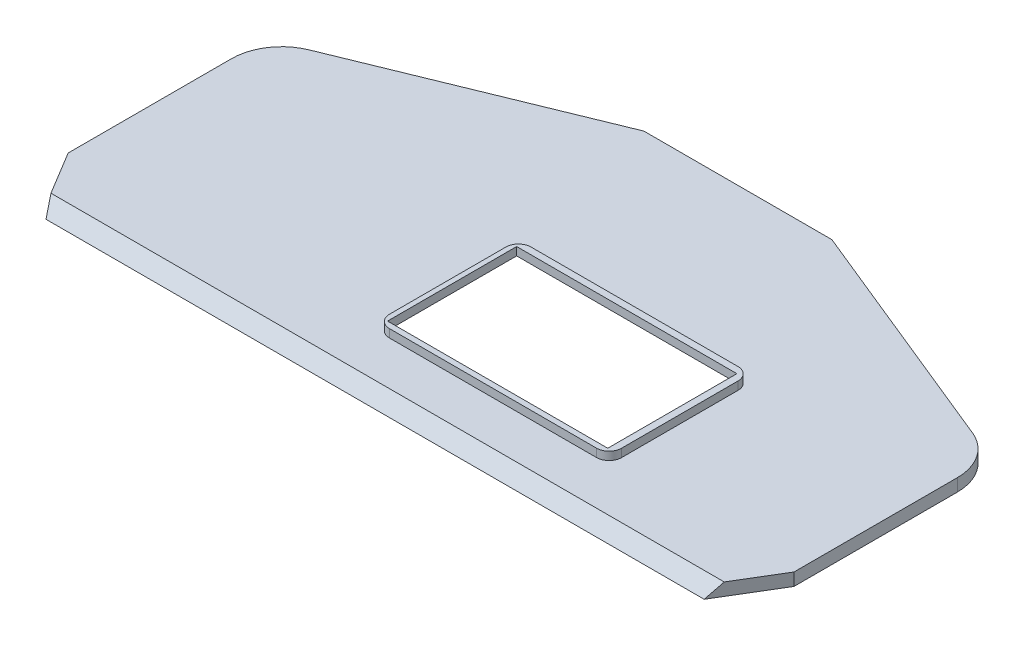
ISO-10303-21;
HEADER;
FILE_DESCRIPTION(('STEP AP214'),'2;1');
FILE_NAME('part.step','',(''),(''),'','','');
FILE_SCHEMA(('AUTOMOTIVE_DESIGN { 1 0 10303 214 1 1 1 1 }'));
ENDSEC;
DATA;
#1=APPLICATION_CONTEXT('core data for automotive mechanical design processes');
#2=APPLICATION_PROTOCOL_DEFINITION('international standard','automotive_design',2000,#1);
#3=PRODUCT_CONTEXT('',#1,'mechanical');
#4=PRODUCT('Part','Part','',(#3));
#5=PRODUCT_RELATED_PRODUCT_CATEGORY('part','',(#4));
#6=PRODUCT_DEFINITION_FORMATION('','',#4);
#7=PRODUCT_DEFINITION_CONTEXT('part definition',#1,'design');
#8=PRODUCT_DEFINITION('design','',#6,#7);
#9=PRODUCT_DEFINITION_SHAPE('','',#8);
#10=(LENGTH_UNIT() NAMED_UNIT(*) SI_UNIT(.MILLI.,.METRE.));
#11=(NAMED_UNIT(*) PLANE_ANGLE_UNIT() SI_UNIT($,.RADIAN.));
#12=(NAMED_UNIT(*) SI_UNIT($,.STERADIAN.) SOLID_ANGLE_UNIT());
#13=UNCERTAINTY_MEASURE_WITH_UNIT(LENGTH_MEASURE(1.E-05),#10,'distance_accuracy_value','');
#14=(GEOMETRIC_REPRESENTATION_CONTEXT(3) GLOBAL_UNCERTAINTY_ASSIGNED_CONTEXT((#13)) GLOBAL_UNIT_ASSIGNED_CONTEXT((#10,
#11,#12)) REPRESENTATION_CONTEXT('',''));
#15=CARTESIAN_POINT('',(0.,0.,0.));
#16=DIRECTION('',(0.,0.,1.));
#17=DIRECTION('',(1.,0.,0.));
#18=AXIS2_PLACEMENT_3D('',#15,#16,#17);
#19=CARTESIAN_POINT('',(-6.68634207264396,3.3,-29.1142175540504));
#20=DIRECTION('',(0.,1.,0.));
#21=DIRECTION('',(0.,0.,1.));
#22=AXIS2_PLACEMENT_3D('',#19,#20,#21);
#23=CYLINDRICAL_SURFACE('',#22,2.);
#24=DIRECTION('',(0.,1.,0.));
#25=VECTOR('',#24,1.);
#26=CARTESIAN_POINT('',(-8.68634207264396,3.3,-29.1142175540504));
#27=LINE('',#26,#25);
#28=CARTESIAN_POINT('',(-8.68634207264396,2.,-29.1142175540504));
#29=VERTEX_POINT('',#28);
#30=CARTESIAN_POINT('',(-8.68634207264396,3.3,-29.1142175540504));
#31=VERTEX_POINT('',#30);
#32=EDGE_CURVE('E356',#29,#31,#27,.T.);
#33=ORIENTED_EDGE('',*,*,#32,.F.);
#34=CARTESIAN_POINT('',(-6.68634207264396,2.,-29.1142175540504));
#35=DIRECTION('',(0.,-1.,0.));
#36=DIRECTION('',(0.,0.,-1.));
#37=AXIS2_PLACEMENT_3D('',#34,#35,#36);
#38=CIRCLE('',#37,2.);
#39=CARTESIAN_POINT('',(-6.68634207264396,2.,-27.1142175540504));
#40=VERTEX_POINT('',#39);
#41=EDGE_CURVE('E364',#29,#40,#38,.F.);
#42=ORIENTED_EDGE('',*,*,#41,.T.);
#43=DIRECTION('',(0.,1.,0.));
#44=VECTOR('',#43,1.);
#45=CARTESIAN_POINT('',(-6.68634207264396,3.3,-27.1142175540504));
#46=LINE('',#45,#44);
#47=CARTESIAN_POINT('',(-6.68634207264396,3.3,-27.1142175540504));
#48=VERTEX_POINT('',#47);
#49=EDGE_CURVE('E359',#48,#40,#46,.F.);
#50=ORIENTED_EDGE('',*,*,#49,.F.);
#51=CARTESIAN_POINT('',(-6.68634207264396,3.3,-29.1142175540504));
#52=DIRECTION('',(0.,-1.,0.));
#53=DIRECTION('',(0.,0.,-1.));
#54=AXIS2_PLACEMENT_3D('',#51,#52,#53);
#55=CIRCLE('',#54,2.);
#56=EDGE_CURVE('E362',#31,#48,#55,.F.);
#57=ORIENTED_EDGE('',*,*,#56,.F.);
#58=EDGE_LOOP('',(#33,#42,#50,#57));
#59=FACE_BOUND('',#58,.T.);
#60=ADVANCED_FACE('F35',(#59),#23,.T.);
#61=CARTESIAN_POINT('',(26.3385652794544,3.3,-29.1142175540504));
#62=DIRECTION('',(0.,1.,0.));
#63=DIRECTION('',(0.,0.,1.));
#64=AXIS2_PLACEMENT_3D('',#61,#62,#63);
#65=CYLINDRICAL_SURFACE('',#64,2.);
#66=DIRECTION('',(0.,1.,0.));
#67=VECTOR('',#66,1.);
#68=CARTESIAN_POINT('',(26.3385652794544,3.3,-27.1142175540504));
#69=LINE('',#68,#67);
#70=CARTESIAN_POINT('',(26.3385652794544,2.,-27.1142175540504));
#71=VERTEX_POINT('',#70);
#72=CARTESIAN_POINT('',(26.3385652794544,3.3,-27.1142175540504));
#73=VERTEX_POINT('',#72);
#74=EDGE_CURVE('E346',#71,#73,#69,.T.);
#75=ORIENTED_EDGE('',*,*,#74,.F.);
#76=CARTESIAN_POINT('',(26.3385652794544,2.,-29.1142175540504));
#77=DIRECTION('',(0.,-1.,0.));
#78=DIRECTION('',(0.,0.,-1.));
#79=AXIS2_PLACEMENT_3D('',#76,#77,#78);
#80=CIRCLE('',#79,2.);
#81=CARTESIAN_POINT('',(28.3385652794544,2.,-29.1142175540504));
#82=VERTEX_POINT('',#81);
#83=EDGE_CURVE('E354',#71,#82,#80,.F.);
#84=ORIENTED_EDGE('',*,*,#83,.T.);
#85=DIRECTION('',(0.,1.,0.));
#86=VECTOR('',#85,1.);
#87=CARTESIAN_POINT('',(28.3385652794544,3.3,-29.1142175540504));
#88=LINE('',#87,#86);
#89=CARTESIAN_POINT('',(28.3385652794544,3.3,-29.1142175540504));
#90=VERTEX_POINT('',#89);
#91=EDGE_CURVE('E349',#90,#82,#88,.F.);
#92=ORIENTED_EDGE('',*,*,#91,.F.);
#93=CARTESIAN_POINT('',(26.3385652794544,3.3,-29.1142175540504));
#94=DIRECTION('',(0.,-1.,0.));
#95=DIRECTION('',(0.,0.,-1.));
#96=AXIS2_PLACEMENT_3D('',#93,#94,#95);
#97=CIRCLE('',#96,2.);
#98=EDGE_CURVE('E352',#73,#90,#97,.F.);
#99=ORIENTED_EDGE('',*,*,#98,.F.);
#100=EDGE_LOOP('',(#75,#84,#92,#99));
#101=FACE_BOUND('',#100,.T.);
#102=ADVANCED_FACE('F462',(#101),#65,.T.);
#103=CARTESIAN_POINT('',(26.3385652794544,3.3,-47.6782183309184));
#104=DIRECTION('',(0.,1.,0.));
#105=DIRECTION('',(0.,0.,1.));
#106=AXIS2_PLACEMENT_3D('',#103,#104,#105);
#107=CYLINDRICAL_SURFACE('',#106,2.);
#108=DIRECTION('',(0.,1.,0.));
#109=VECTOR('',#108,1.);
#110=CARTESIAN_POINT('',(28.3385652794544,3.3,-47.6782183309184));
#111=LINE('',#110,#109);
#112=CARTESIAN_POINT('',(28.3385652794544,2.,-47.6782183309184));
#113=VERTEX_POINT('',#112);
#114=CARTESIAN_POINT('',(28.3385652794544,3.3,-47.6782183309184));
#115=VERTEX_POINT('',#114);
#116=EDGE_CURVE('E336',#113,#115,#111,.T.);
#117=ORIENTED_EDGE('',*,*,#116,.F.);
#118=CARTESIAN_POINT('',(26.3385652794544,2.,-47.6782183309184));
#119=DIRECTION('',(0.,-1.,0.));
#120=DIRECTION('',(0.,0.,-1.));
#121=AXIS2_PLACEMENT_3D('',#118,#119,#120);
#122=CIRCLE('',#121,2.);
#123=CARTESIAN_POINT('',(26.3385652794544,2.,-49.6782183309184));
#124=VERTEX_POINT('',#123);
#125=EDGE_CURVE('E344',#113,#124,#122,.F.);
#126=ORIENTED_EDGE('',*,*,#125,.T.);
#127=DIRECTION('',(0.,1.,0.));
#128=VECTOR('',#127,1.);
#129=CARTESIAN_POINT('',(26.3385652794544,3.3,-49.6782183309184));
#130=LINE('',#129,#128);
#131=CARTESIAN_POINT('',(26.3385652794544,3.3,-49.6782183309184));
#132=VERTEX_POINT('',#131);
#133=EDGE_CURVE('E339',#132,#124,#130,.F.);
#134=ORIENTED_EDGE('',*,*,#133,.F.);
#135=CARTESIAN_POINT('',(26.3385652794544,3.3,-47.6782183309184));
#136=DIRECTION('',(0.,-1.,0.));
#137=DIRECTION('',(0.,0.,-1.));
#138=AXIS2_PLACEMENT_3D('',#135,#136,#137);
#139=CIRCLE('',#138,2.);
#140=EDGE_CURVE('E342',#115,#132,#139,.F.);
#141=ORIENTED_EDGE('',*,*,#140,.F.);
#142=EDGE_LOOP('',(#117,#126,#134,#141));
#143=FACE_BOUND('',#142,.T.);
#144=ADVANCED_FACE('F468',(#143),#107,.T.);
#145=CARTESIAN_POINT('',(-6.68634207264396,3.3,-47.6782183309184));
#146=DIRECTION('',(0.,-1.,0.));
#147=DIRECTION('',(0.,0.,-1.));
#148=AXIS2_PLACEMENT_3D('',#145,#146,#147);
#149=CYLINDRICAL_SURFACE('',#148,2.);
#150=DIRECTION('',(0.,-1.,0.));
#151=VECTOR('',#150,1.);
#152=CARTESIAN_POINT('',(-8.68634207264396,3.3,-47.6782183309184));
#153=LINE('',#152,#151);
#154=CARTESIAN_POINT('',(-8.68634207264396,3.3,-47.6782183309184));
#155=VERTEX_POINT('',#154);
#156=CARTESIAN_POINT('',(-8.68634207264396,2.,-47.6782183309184));
#157=VERTEX_POINT('',#156);
#158=EDGE_CURVE('E326',#155,#157,#153,.T.);
#159=ORIENTED_EDGE('',*,*,#158,.F.);
#160=CARTESIAN_POINT('',(-6.68634207264396,3.3,-47.6782183309184));
#161=DIRECTION('',(0.,-1.,0.));
#162=DIRECTION('',(0.,0.,-1.));
#163=AXIS2_PLACEMENT_3D('',#160,#161,#162);
#164=CIRCLE('',#163,2.);
#165=CARTESIAN_POINT('',(-6.68634207264396,3.3,-49.6782183309184));
#166=VERTEX_POINT('',#165);
#167=EDGE_CURVE('E332',#166,#155,#164,.F.);
#168=ORIENTED_EDGE('',*,*,#167,.F.);
#169=DIRECTION('',(0.,-1.,0.));
#170=VECTOR('',#169,1.);
#171=CARTESIAN_POINT('',(-6.68634207264396,3.3,-49.6782183309184));
#172=LINE('',#171,#170);
#173=CARTESIAN_POINT('',(-6.68634207264396,2.,-49.6782183309184));
#174=VERTEX_POINT('',#173);
#175=EDGE_CURVE('E329',#174,#166,#172,.F.);
#176=ORIENTED_EDGE('',*,*,#175,.F.);
#177=CARTESIAN_POINT('',(-6.68634207264396,2.,-47.6782183309184));
#178=DIRECTION('',(0.,-1.,0.));
#179=DIRECTION('',(0.,0.,-1.));
#180=AXIS2_PLACEMENT_3D('',#177,#178,#179);
#181=CIRCLE('',#180,2.);
#182=EDGE_CURVE('E334',#174,#157,#181,.F.);
#183=ORIENTED_EDGE('',*,*,#182,.T.);
#184=EDGE_LOOP('',(#159,#168,#176,#183));
#185=FACE_BOUND('',#184,.T.);
#186=ADVANCED_FACE('F458',(#185),#149,.T.);
#187=CARTESIAN_POINT('',(0.,2.,0.));
#188=DIRECTION('',(0.,-1.,0.));
#189=DIRECTION('',(0.,0.,-1.));
#190=AXIS2_PLACEMENT_3D('',#187,#188,#189);
#191=PLANE('',#190);
#192=DIRECTION('',(0.516880813371229,0.,0.856057372358124));
#193=VECTOR('',#192,1.);
#194=CARTESIAN_POINT('',(-57.8941255649987,2.,-27.0518446231634));
#195=LINE('',#194,#193);
#196=CARTESIAN_POINT('',(-57.8941255649987,2.,-27.0518446231634));
#197=VERTEX_POINT('',#196);
#198=CARTESIAN_POINT('',(-53.7075845149197,2.,-20.1181004448395));
#199=VERTEX_POINT('',#198);
#200=EDGE_CURVE('E262',#197,#199,#195,.T.);
#201=ORIENTED_EDGE('',*,*,#200,.T.);
#202=DIRECTION('',(1.,0.,0.));
#203=VECTOR('',#202,1.);
#204=CARTESIAN_POINT('',(0.,2.,-20.1181004448395));
#205=LINE('',#204,#203);
#206=CARTESIAN_POINT('',(53.7075845149196,2.,-20.1181004448395));
#207=VERTEX_POINT('',#206);
#208=EDGE_CURVE('E319',#199,#207,#205,.T.);
#209=ORIENTED_EDGE('',*,*,#208,.T.);
#210=DIRECTION('',(0.516880813371228,0.,-0.856057372358125));
#211=VECTOR('',#210,1.);
#212=CARTESIAN_POINT('',(57.8941255649987,2.,-27.0518446231634));
#213=LINE('',#212,#211);
#214=CARTESIAN_POINT('',(57.8941255649987,2.,-27.0518446231634));
#215=VERTEX_POINT('',#214);
#216=EDGE_CURVE('E265',#207,#215,#213,.T.);
#217=ORIENTED_EDGE('',*,*,#216,.T.);
#218=DIRECTION('',(0.,0.,-1.));
#219=VECTOR('',#218,1.);
#220=CARTESIAN_POINT('',(57.8941255649987,2.,-58.4853889543034));
#221=LINE('',#220,#219);
#222=CARTESIAN_POINT('',(57.8941255649987,2.,-53.110753987666));
#223=VERTEX_POINT('',#222);
#224=EDGE_CURVE('E267',#215,#223,#221,.T.);
#225=ORIENTED_EDGE('',*,*,#224,.T.);
#226=CARTESIAN_POINT('',(49.8941255649987,2.,-53.1107539876659));
#227=DIRECTION('',(0.,-1.,0.));
#228=DIRECTION('',(0.,0.,-1.));
#229=AXIS2_PLACEMENT_3D('',#226,#227,#228);
#230=CIRCLE('',#229,8.);
#231=CARTESIAN_POINT('',(52.9183086687649,2.,-60.5171239861804));
#232=VERTEX_POINT('',#231);
#233=EDGE_CURVE('E307',#223,#232,#230,.F.);
#234=ORIENTED_EDGE('',*,*,#233,.T.);
#235=DIRECTION('',(-0.925796249814304,0.,-0.378022887970782));
#236=VECTOR('',#235,1.);
#237=CARTESIAN_POINT('',(15.,2.,-76.));
#238=LINE('',#237,#236);
#239=CARTESIAN_POINT('',(15.,2.,-76.));
#240=VERTEX_POINT('',#239);
#241=EDGE_CURVE('E252',#232,#240,#238,.T.);
#242=ORIENTED_EDGE('',*,*,#241,.T.);
#243=DIRECTION('',(-1.,0.,0.));
#244=VECTOR('',#243,1.);
#245=CARTESIAN_POINT('',(-15.0000000000001,2.,-76.));
#246=LINE('',#245,#244);
#247=CARTESIAN_POINT('',(-15.0000000000001,2.,-76.));
#248=VERTEX_POINT('',#247);
#249=EDGE_CURVE('E254',#240,#248,#246,.T.);
#250=ORIENTED_EDGE('',*,*,#249,.T.);
#251=DIRECTION('',(-0.925796249814304,0.,0.378022887970783));
#252=VECTOR('',#251,1.);
#253=CARTESIAN_POINT('',(-15.0000000000001,2.,-76.));
#254=LINE('',#253,#252);
#255=CARTESIAN_POINT('',(-52.918308668765,2.,-60.5171239861804));
#256=VERTEX_POINT('',#255);
#257=EDGE_CURVE('E257',#248,#256,#254,.T.);
#258=ORIENTED_EDGE('',*,*,#257,.T.);
#259=CARTESIAN_POINT('',(-49.8941255649987,2.,-53.1107539876659));
#260=DIRECTION('',(0.,-1.,0.));
#261=DIRECTION('',(0.,0.,-1.));
#262=AXIS2_PLACEMENT_3D('',#259,#260,#261);
#263=CIRCLE('',#262,8.);
#264=CARTESIAN_POINT('',(-57.8941255649987,2.,-53.1107539876659));
#265=VERTEX_POINT('',#264);
#266=EDGE_CURVE('E317',#256,#265,#263,.F.);
#267=ORIENTED_EDGE('',*,*,#266,.T.);
#268=DIRECTION('',(0.,0.,1.));
#269=VECTOR('',#268,1.);
#270=CARTESIAN_POINT('',(-57.8941255649987,2.,-58.4853889543033));
#271=LINE('',#270,#269);
#272=EDGE_CURVE('E260',#265,#197,#271,.T.);
#273=ORIENTED_EDGE('',*,*,#272,.T.);
#274=EDGE_LOOP('',(#201,#209,#217,#225,#234,#242,#250,#258,#267,#273));
#275=FACE_BOUND('',#274,.T.);
#276=DIRECTION('',(0.,0.,1.));
#277=VECTOR('',#276,1.);
#278=CARTESIAN_POINT('',(-8.68634207264396,2.,-27.1142175540504));
#279=LINE('',#278,#277);
#280=EDGE_CURVE('E230',#157,#29,#279,.T.);
#281=ORIENTED_EDGE('',*,*,#280,.F.);
#282=ORIENTED_EDGE('',*,*,#182,.F.);
#283=DIRECTION('',(-1.,0.,0.));
#284=VECTOR('',#283,1.);
#285=CARTESIAN_POINT('',(-8.68634207264396,2.,-49.6782183309184));
#286=LINE('',#285,#284);
#287=EDGE_CURVE('E235',#124,#174,#286,.T.);
#288=ORIENTED_EDGE('',*,*,#287,.F.);
#289=ORIENTED_EDGE('',*,*,#125,.F.);
#290=DIRECTION('',(0.,0.,-1.));
#291=VECTOR('',#290,1.);
#292=CARTESIAN_POINT('',(28.3385652794544,2.,-49.6782183309184));
#293=LINE('',#292,#291);
#294=EDGE_CURVE('E245',#82,#113,#293,.T.);
#295=ORIENTED_EDGE('',*,*,#294,.F.);
#296=ORIENTED_EDGE('',*,*,#83,.F.);
#297=DIRECTION('',(1.,0.,0.));
#298=VECTOR('',#297,1.);
#299=CARTESIAN_POINT('',(28.3385652794544,2.,-27.1142175540504));
#300=LINE('',#299,#298);
#301=EDGE_CURVE('E243',#40,#71,#300,.T.);
#302=ORIENTED_EDGE('',*,*,#301,.F.);
#303=ORIENTED_EDGE('',*,*,#41,.F.);
#304=EDGE_LOOP('',(#281,#282,#288,#289,#295,#296,#302,#303));
#305=FACE_BOUND('',#304,.T.);
#306=ADVANCED_FACE('F421',(#275,#305),#191,.F.);
#307=CARTESIAN_POINT('',(-49.8941255649987,2.,-53.1107539876659));
#308=DIRECTION('',(0.,1.,0.));
#309=DIRECTION('',(0.,0.,1.));
#310=AXIS2_PLACEMENT_3D('',#307,#308,#309);
#311=CYLINDRICAL_SURFACE('',#310,8.);
#312=DIRECTION('',(0.,1.,0.));
#313=VECTOR('',#312,1.);
#314=CARTESIAN_POINT('',(-52.918308668765,2.,-60.5171239861804));
#315=LINE('',#314,#313);
#316=CARTESIAN_POINT('',(-52.918308668765,0.,-60.5171239861804));
#317=VERTEX_POINT('',#316);
#318=EDGE_CURVE('E309',#317,#256,#315,.T.);
#319=ORIENTED_EDGE('',*,*,#318,.F.);
#320=CARTESIAN_POINT('',(-49.8941255649987,0.,-53.1107539876659));
#321=DIRECTION('',(0.,-1.,0.));
#322=DIRECTION('',(0.,0.,-1.));
#323=AXIS2_PLACEMENT_3D('',#320,#321,#322);
#324=CIRCLE('',#323,8.);
#325=CARTESIAN_POINT('',(-57.8941255649987,0.,-53.1107539876659));
#326=VERTEX_POINT('',#325);
#327=EDGE_CURVE('E315',#326,#317,#324,.T.);
#328=ORIENTED_EDGE('',*,*,#327,.F.);
#329=DIRECTION('',(0.,1.,0.));
#330=VECTOR('',#329,1.);
#331=CARTESIAN_POINT('',(-57.8941255649987,2.,-53.1107539876659));
#332=LINE('',#331,#330);
#333=EDGE_CURVE('E312',#265,#326,#332,.F.);
#334=ORIENTED_EDGE('',*,*,#333,.F.);
#335=ORIENTED_EDGE('',*,*,#266,.F.);
#336=EDGE_LOOP('',(#319,#328,#334,#335));
#337=FACE_BOUND('',#336,.T.);
#338=ADVANCED_FACE('F450',(#337),#311,.T.);
#339=CARTESIAN_POINT('',(49.8941255649987,2.,-53.1107539876659));
#340=DIRECTION('',(0.,1.,0.));
#341=DIRECTION('',(0.,0.,1.));
#342=AXIS2_PLACEMENT_3D('',#339,#340,#341);
#343=CYLINDRICAL_SURFACE('',#342,8.);
#344=DIRECTION('',(0.,1.,0.));
#345=VECTOR('',#344,1.);
#346=CARTESIAN_POINT('',(57.8941255649987,2.,-53.1107539876659));
#347=LINE('',#346,#345);
#348=CARTESIAN_POINT('',(57.8941255649987,0.,-53.110753987666));
#349=VERTEX_POINT('',#348);
#350=EDGE_CURVE('E299',#349,#223,#347,.T.);
#351=ORIENTED_EDGE('',*,*,#350,.F.);
#352=CARTESIAN_POINT('',(49.8941255649987,0.,-53.1107539876659));
#353=DIRECTION('',(0.,-1.,0.));
#354=DIRECTION('',(0.,0.,-1.));
#355=AXIS2_PLACEMENT_3D('',#352,#353,#354);
#356=CIRCLE('',#355,8.);
#357=CARTESIAN_POINT('',(52.9183086687649,0.,-60.5171239861804));
#358=VERTEX_POINT('',#357);
#359=EDGE_CURVE('E305',#358,#349,#356,.T.);
#360=ORIENTED_EDGE('',*,*,#359,.F.);
#361=DIRECTION('',(0.,1.,0.));
#362=VECTOR('',#361,1.);
#363=CARTESIAN_POINT('',(52.9183086687649,2.,-60.5171239861804));
#364=LINE('',#363,#362);
#365=EDGE_CURVE('E302',#232,#358,#364,.F.);
#366=ORIENTED_EDGE('',*,*,#365,.F.);
#367=ORIENTED_EDGE('',*,*,#233,.F.);
#368=EDGE_LOOP('',(#351,#360,#366,#367));
#369=FACE_BOUND('',#368,.T.);
#370=ADVANCED_FACE('F403',(#369),#343,.T.);
#371=CARTESIAN_POINT('',(0.,0.,0.));
#372=DIRECTION('',(0.,-1.,0.));
#373=DIRECTION('',(0.,0.,-1.));
#374=AXIS2_PLACEMENT_3D('',#371,#372,#373);
#375=PLANE('',#374);
#376=DIRECTION('',(-1.,0.,0.));
#377=VECTOR('',#376,1.);
#378=CARTESIAN_POINT('',(-2.06891598330033E-13,0.,-50.6));
#379=LINE('',#378,#377);
#380=CARTESIAN_POINT('',(29.238755392327,0.,-50.6000000000002));
#381=VERTEX_POINT('',#380);
#382=CARTESIAN_POINT('',(-9.89412556499875,0.,-50.6));
#383=VERTEX_POINT('',#382);
#384=EDGE_CURVE('E380',#381,#383,#379,.T.);
#385=ORIENTED_EDGE('',*,*,#384,.T.);
#386=DIRECTION('',(0.,0.,1.));
#387=VECTOR('',#386,1.);
#388=CARTESIAN_POINT('',(-9.89412556499875,0.,-26.));
#389=LINE('',#388,#387);
#390=CARTESIAN_POINT('',(-9.89412556499875,0.,-26.));
#391=VERTEX_POINT('',#390);
#392=EDGE_CURVE('E50',#383,#391,#389,.T.);
#393=ORIENTED_EDGE('',*,*,#392,.T.);
#394=DIRECTION('',(1.,0.,0.));
#395=VECTOR('',#394,1.);
#396=CARTESIAN_POINT('',(0.,0.,-26.));
#397=LINE('',#396,#395);
#398=CARTESIAN_POINT('',(29.238755392327,0.,-26.));
#399=VERTEX_POINT('',#398);
#400=EDGE_CURVE('E370',#391,#399,#397,.T.);
#401=ORIENTED_EDGE('',*,*,#400,.T.);
#402=DIRECTION('',(0.,0.,-1.));
#403=VECTOR('',#402,1.);
#404=CARTESIAN_POINT('',(29.238755392327,0.,-48.6));
#405=LINE('',#404,#403);
#406=EDGE_CURVE('E58',#399,#381,#405,.T.);
#407=ORIENTED_EDGE('',*,*,#406,.T.);
#408=EDGE_LOOP('',(#385,#393,#401,#407));
#409=FACE_BOUND('',#408,.T.);
#410=DIRECTION('',(0.,0.,1.));
#411=VECTOR('',#410,1.);
#412=CARTESIAN_POINT('',(-57.8941255649987,0.,-58.4853889543033));
#413=LINE('',#412,#411);
#414=CARTESIAN_POINT('',(-57.8941255649987,0.,-27.0518446231634));
#415=VERTEX_POINT('',#414);
#416=EDGE_CURVE('E277',#326,#415,#413,.T.);
#417=ORIENTED_EDGE('',*,*,#416,.F.);
#418=ORIENTED_EDGE('',*,*,#327,.T.);
#419=DIRECTION('',(-0.925796249814304,0.,0.378022887970783));
#420=VECTOR('',#419,1.);
#421=CARTESIAN_POINT('',(-15.0000000000001,0.,-76.));
#422=LINE('',#421,#420);
#423=CARTESIAN_POINT('',(-15.0000000000001,0.,-76.));
#424=VERTEX_POINT('',#423);
#425=EDGE_CURVE('E274',#424,#317,#422,.T.);
#426=ORIENTED_EDGE('',*,*,#425,.F.);
#427=DIRECTION('',(-1.,0.,0.));
#428=VECTOR('',#427,1.);
#429=CARTESIAN_POINT('',(-15.0000000000001,0.,-76.));
#430=LINE('',#429,#428);
#431=CARTESIAN_POINT('',(15.,0.,-76.));
#432=VERTEX_POINT('',#431);
#433=EDGE_CURVE('E272',#432,#424,#430,.T.);
#434=ORIENTED_EDGE('',*,*,#433,.F.);
#435=DIRECTION('',(-0.925796249814304,0.,-0.378022887970782));
#436=VECTOR('',#435,1.);
#437=CARTESIAN_POINT('',(15.,0.,-76.));
#438=LINE('',#437,#436);
#439=EDGE_CURVE('E250',#358,#432,#438,.T.);
#440=ORIENTED_EDGE('',*,*,#439,.F.);
#441=ORIENTED_EDGE('',*,*,#359,.T.);
#442=DIRECTION('',(0.,0.,-1.));
#443=VECTOR('',#442,1.);
#444=CARTESIAN_POINT('',(57.8941255649987,0.,-58.4853889543034));
#445=LINE('',#444,#443);
#446=CARTESIAN_POINT('',(57.8941255649987,0.,-27.0518446231634));
#447=VERTEX_POINT('',#446);
#448=EDGE_CURVE('E255',#447,#349,#445,.T.);
#449=ORIENTED_EDGE('',*,*,#448,.F.);
#450=DIRECTION('',(0.516880813371228,0.,-0.856057372358125));
#451=VECTOR('',#450,1.);
#452=CARTESIAN_POINT('',(57.8941255649987,0.,-27.0518446231634));
#453=LINE('',#452,#451);
#454=CARTESIAN_POINT('',(52.5,0.,-18.1181004448395));
#455=VERTEX_POINT('',#454);
#456=EDGE_CURVE('E284',#455,#447,#453,.T.);
#457=ORIENTED_EDGE('',*,*,#456,.F.);
#458=DIRECTION('',(1.,0.,0.));
#459=VECTOR('',#458,1.);
#460=CARTESIAN_POINT('',(-52.5,0.,-18.1181004448394));
#461=LINE('',#460,#459);
#462=CARTESIAN_POINT('',(-52.5,0.,-18.1181004448394));
#463=VERTEX_POINT('',#462);
#464=EDGE_CURVE('E281',#463,#455,#461,.T.);
#465=ORIENTED_EDGE('',*,*,#464,.F.);
#466=DIRECTION('',(0.516880813371229,0.,0.856057372358124));
#467=VECTOR('',#466,1.);
#468=CARTESIAN_POINT('',(-57.8941255649987,0.,-27.0518446231634));
#469=LINE('',#468,#467);
#470=EDGE_CURVE('E279',#415,#463,#469,.T.);
#471=ORIENTED_EDGE('',*,*,#470,.F.);
#472=EDGE_LOOP('',(#417,#418,#426,#434,#440,#441,#449,#457,#465,#471));
#473=FACE_BOUND('',#472,.T.);
#474=ADVANCED_FACE('F399',(#409,#473),#375,.T.);
#475=CARTESIAN_POINT('',(15.,2.,-76.));
#476=DIRECTION('',(-0.378022887970782,0.,0.925796249814304));
#477=DIRECTION('',(0.925796249814304,0.,0.378022887970782));
#478=AXIS2_PLACEMENT_3D('',#475,#476,#477);
#479=PLANE('',#478);
#480=ORIENTED_EDGE('',*,*,#241,.F.);
#481=ORIENTED_EDGE('',*,*,#365,.T.);
#482=ORIENTED_EDGE('',*,*,#439,.T.);
#483=DIRECTION('',(0.,-1.,0.));
#484=VECTOR('',#483,1.);
#485=CARTESIAN_POINT('',(15.,2.,-76.));
#486=LINE('',#485,#484);
#487=EDGE_CURVE('E296',#240,#432,#486,.T.);
#488=ORIENTED_EDGE('',*,*,#487,.F.);
#489=EDGE_LOOP('',(#480,#481,#482,#488));
#490=FACE_BOUND('',#489,.T.);
#491=ADVANCED_FACE('F402',(#490),#479,.F.);
#492=CARTESIAN_POINT('',(-15.0000000000001,2.,-76.));
#493=DIRECTION('',(0.,0.,1.));
#494=DIRECTION('',(1.,0.,0.));
#495=AXIS2_PLACEMENT_3D('',#492,#493,#494);
#496=PLANE('',#495);
#497=ORIENTED_EDGE('',*,*,#433,.T.);
#498=DIRECTION('',(0.,-1.,0.));
#499=VECTOR('',#498,1.);
#500=CARTESIAN_POINT('',(-15.0000000000001,2.,-76.));
#501=LINE('',#500,#499);
#502=EDGE_CURVE('E293',#248,#424,#501,.T.);
#503=ORIENTED_EDGE('',*,*,#502,.F.);
#504=ORIENTED_EDGE('',*,*,#249,.F.);
#505=ORIENTED_EDGE('',*,*,#487,.T.);
#506=EDGE_LOOP('',(#497,#503,#504,#505));
#507=FACE_BOUND('',#506,.T.);
#508=ADVANCED_FACE('F444',(#507),#496,.F.);
#509=CARTESIAN_POINT('',(-15.0000000000001,2.,-76.));
#510=DIRECTION('',(0.378022887970783,0.,0.925796249814304));
#511=DIRECTION('',(0.925796249814304,0.,-0.378022887970783));
#512=AXIS2_PLACEMENT_3D('',#509,#510,#511);
#513=PLANE('',#512);
#514=ORIENTED_EDGE('',*,*,#425,.T.);
#515=ORIENTED_EDGE('',*,*,#318,.T.);
#516=ORIENTED_EDGE('',*,*,#257,.F.);
#517=ORIENTED_EDGE('',*,*,#502,.T.);
#518=EDGE_LOOP('',(#514,#515,#516,#517));
#519=FACE_BOUND('',#518,.T.);
#520=ADVANCED_FACE('F448',(#519),#513,.F.);
#521=CARTESIAN_POINT('',(-57.8941255649987,2.,-58.4853889543033));
#522=DIRECTION('',(1.,0.,0.));
#523=DIRECTION('',(0.,0.,-1.));
#524=AXIS2_PLACEMENT_3D('',#521,#522,#523);
#525=PLANE('',#524);
#526=ORIENTED_EDGE('',*,*,#272,.F.);
#527=ORIENTED_EDGE('',*,*,#333,.T.);
#528=ORIENTED_EDGE('',*,*,#416,.T.);
#529=DIRECTION('',(0.,-1.,0.));
#530=VECTOR('',#529,1.);
#531=CARTESIAN_POINT('',(-57.8941255649987,2.,-27.0518446231634));
#532=LINE('',#531,#530);
#533=EDGE_CURVE('E290',#197,#415,#532,.T.);
#534=ORIENTED_EDGE('',*,*,#533,.F.);
#535=EDGE_LOOP('',(#526,#527,#528,#534));
#536=FACE_BOUND('',#535,.T.);
#537=ADVANCED_FACE('F413',(#536),#525,.F.);
#538=CARTESIAN_POINT('',(-57.8941255649987,2.,-27.0518446231634));
#539=DIRECTION('',(0.856057372358124,0.,-0.516880813371229));
#540=DIRECTION('',(-0.516880813371229,0.,-0.856057372358124));
#541=AXIS2_PLACEMENT_3D('',#538,#539,#540);
#542=PLANE('',#541);
#543=ORIENTED_EDGE('',*,*,#470,.T.);
#544=DIRECTION('',(0.392655696977441,-0.650315886178081,0.650315886178077));
#545=VECTOR('',#544,1.);
#546=CARTESIAN_POINT('',(-45.4270298908069,-11.7142444637324,-6.40385598110714));
#547=LINE('',#546,#545);
#548=EDGE_CURVE('E324',#463,#199,#547,.F.);
#549=ORIENTED_EDGE('',*,*,#548,.T.);
#550=ORIENTED_EDGE('',*,*,#200,.F.);
#551=ORIENTED_EDGE('',*,*,#533,.T.);
#552=EDGE_LOOP('',(#543,#549,#550,#551));
#553=FACE_BOUND('',#552,.T.);
#554=ADVANCED_FACE('F417',(#553),#542,.F.);
#555=CARTESIAN_POINT('',(57.8941255649987,2.,-27.0518446231634));
#556=DIRECTION('',(-0.856057372358125,0.,-0.516880813371228));
#557=DIRECTION('',(-0.516880813371228,0.,0.856057372358125));
#558=AXIS2_PLACEMENT_3D('',#555,#556,#557);
#559=PLANE('',#558);
#560=ORIENTED_EDGE('',*,*,#216,.F.);
#561=DIRECTION('',(0.39265569697744,0.650315886178081,-0.650315886178077));
#562=VECTOR('',#561,1.);
#563=CARTESIAN_POINT('',(45.4270298908069,-11.7142444637324,-6.40385598110718));
#564=LINE('',#563,#562);
#565=EDGE_CURVE('E322',#207,#455,#564,.F.);
#566=ORIENTED_EDGE('',*,*,#565,.T.);
#567=ORIENTED_EDGE('',*,*,#456,.T.);
#568=DIRECTION('',(0.,-1.,0.));
#569=VECTOR('',#568,1.);
#570=CARTESIAN_POINT('',(57.8941255649987,2.,-27.0518446231634));
#571=LINE('',#570,#569);
#572=EDGE_CURVE('E270',#215,#447,#571,.T.);
#573=ORIENTED_EDGE('',*,*,#572,.F.);
#574=EDGE_LOOP('',(#560,#566,#567,#573));
#575=FACE_BOUND('',#574,.T.);
#576=ADVANCED_FACE('F428',(#575),#559,.F.);
#577=CARTESIAN_POINT('',(57.8941255649987,2.,-58.4853889543034));
#578=DIRECTION('',(-1.,0.,0.));
#579=DIRECTION('',(0.,0.,1.));
#580=AXIS2_PLACEMENT_3D('',#577,#578,#579);
#581=PLANE('',#580);
#582=ORIENTED_EDGE('',*,*,#448,.T.);
#583=ORIENTED_EDGE('',*,*,#350,.T.);
#584=ORIENTED_EDGE('',*,*,#224,.F.);
#585=ORIENTED_EDGE('',*,*,#572,.T.);
#586=EDGE_LOOP('',(#582,#583,#584,#585));
#587=FACE_BOUND('',#586,.T.);
#588=ADVANCED_FACE('F434',(#587),#581,.F.);
#589=CARTESIAN_POINT('',(28.5,2.,-28.));
#590=DIRECTION('',(0.,0.,-1.));
#591=DIRECTION('',(-1.,0.,0.));
#592=AXIS2_PLACEMENT_3D('',#589,#590,#591);
#593=PLANE('',#592);
#594=DIRECTION('',(0.,1.,0.));
#595=VECTOR('',#594,1.);
#596=CARTESIAN_POINT('',(27.238755392327,0.,-28.));
#597=LINE('',#596,#595);
#598=CARTESIAN_POINT('',(27.238755392327,1.99999999999999,-28.));
#599=VERTEX_POINT('',#598);
#600=CARTESIAN_POINT('',(27.238755392327,3.3,-28.));
#601=VERTEX_POINT('',#600);
#602=EDGE_CURVE('E211',#599,#601,#597,.T.);
#603=ORIENTED_EDGE('',*,*,#602,.F.);
#604=DIRECTION('',(-1.,0.,0.));
#605=VECTOR('',#604,1.);
#606=CARTESIAN_POINT('',(28.5,2.,-28.));
#607=LINE('',#606,#605);
#608=CARTESIAN_POINT('',(-7.89412556499874,2.,-28.));
#609=VERTEX_POINT('',#608);
#610=EDGE_CURVE('E206',#599,#609,#607,.T.);
#611=ORIENTED_EDGE('',*,*,#610,.T.);
#612=DIRECTION('',(0.,1.,0.));
#613=VECTOR('',#612,1.);
#614=CARTESIAN_POINT('',(-7.89412556499874,-10.,-28.));
#615=LINE('',#614,#613);
#616=CARTESIAN_POINT('',(-7.89412556499874,3.3,-28.));
#617=VERTEX_POINT('',#616);
#618=EDGE_CURVE('E198',#609,#617,#615,.T.);
#619=ORIENTED_EDGE('',*,*,#618,.T.);
#620=DIRECTION('',(1.,0.,0.));
#621=VECTOR('',#620,1.);
#622=CARTESIAN_POINT('',(27.238755392327,3.3,-28.));
#623=LINE('',#622,#621);
#624=EDGE_CURVE('E203',#617,#601,#623,.T.);
#625=ORIENTED_EDGE('',*,*,#624,.T.);
#626=EDGE_LOOP('',(#603,#611,#619,#625));
#627=FACE_BOUND('',#626,.T.);
#628=ADVANCED_FACE('F201',(#627),#593,.T.);
#629=CARTESIAN_POINT('',(0.,2.,-20.1181004448395));
#630=DIRECTION('',(0.,-0.707106781186545,-0.70710678118655));
#631=DIRECTION('',(1.,0.,0.));
#632=AXIS2_PLACEMENT_3D('',#629,#630,#631);
#633=PLANE('',#632);
#634=ORIENTED_EDGE('',*,*,#548,.F.);
#635=ORIENTED_EDGE('',*,*,#464,.T.);
#636=ORIENTED_EDGE('',*,*,#565,.F.);
#637=ORIENTED_EDGE('',*,*,#208,.F.);
#638=EDGE_LOOP('',(#634,#635,#636,#637));
#639=FACE_BOUND('',#638,.T.);
#640=ADVANCED_FACE('F425',(#639),#633,.F.);
#641=CARTESIAN_POINT('',(-7.89412556499874,-10.,0.));
#642=DIRECTION('',(-1.,0.,0.));
#643=DIRECTION('',(0.,0.,1.));
#644=AXIS2_PLACEMENT_3D('',#641,#642,#643);
#645=PLANE('',#644);
#646=ORIENTED_EDGE('',*,*,#618,.F.);
#647=DIRECTION('',(0.,0.,-1.));
#648=VECTOR('',#647,1.);
#649=CARTESIAN_POINT('',(-7.89412556499874,1.99999999999999,-48.6));
#650=LINE('',#649,#648);
#651=CARTESIAN_POINT('',(-7.89412556499874,1.99999999999999,-48.6));
#652=VERTEX_POINT('',#651);
#653=EDGE_CURVE('E375',#609,#652,#650,.T.);
#654=ORIENTED_EDGE('',*,*,#653,.T.);
#655=DIRECTION('',(0.,1.,0.));
#656=VECTOR('',#655,1.);
#657=CARTESIAN_POINT('',(-7.89412556499874,-10.,-48.6));
#658=LINE('',#657,#656);
#659=CARTESIAN_POINT('',(-7.89412556499874,3.3,-48.6));
#660=VERTEX_POINT('',#659);
#661=EDGE_CURVE('E217',#652,#660,#658,.T.);
#662=ORIENTED_EDGE('',*,*,#661,.T.);
#663=DIRECTION('',(0.,0.,1.));
#664=VECTOR('',#663,1.);
#665=CARTESIAN_POINT('',(-7.89412556499874,3.3,-28.));
#666=LINE('',#665,#664);
#667=EDGE_CURVE('E214',#660,#617,#666,.T.);
#668=ORIENTED_EDGE('',*,*,#667,.T.);
#669=EDGE_LOOP('',(#646,#654,#662,#668));
#670=FACE_BOUND('',#669,.T.);
#671=ADVANCED_FACE('F215',(#670),#645,.F.);
#672=CARTESIAN_POINT('',(-1.98714064799201E-13,-10.,-48.6));
#673=DIRECTION('',(0.,0.,1.));
#674=DIRECTION('',(1.,0.,0.));
#675=AXIS2_PLACEMENT_3D('',#672,#673,#674);
#676=PLANE('',#675);
#677=ORIENTED_EDGE('',*,*,#661,.F.);
#678=DIRECTION('',(1.,0.,0.));
#679=VECTOR('',#678,1.);
#680=CARTESIAN_POINT('',(-1.98714064799201E-13,2.,-48.6));
#681=LINE('',#680,#679);
#682=CARTESIAN_POINT('',(27.238755392327,1.99999999999999,-48.6));
#683=VERTEX_POINT('',#682);
#684=EDGE_CURVE('E382',#652,#683,#681,.T.);
#685=ORIENTED_EDGE('',*,*,#684,.T.);
#686=DIRECTION('',(0.,1.,0.));
#687=VECTOR('',#686,1.);
#688=CARTESIAN_POINT('',(27.238755392327,-10.,-48.6));
#689=LINE('',#688,#687);
#690=CARTESIAN_POINT('',(27.238755392327,3.3,-48.6));
#691=VERTEX_POINT('',#690);
#692=EDGE_CURVE('E210',#683,#691,#689,.T.);
#693=ORIENTED_EDGE('',*,*,#692,.T.);
#694=DIRECTION('',(-1.,0.,0.));
#695=VECTOR('',#694,1.);
#696=CARTESIAN_POINT('',(-7.89412556499874,3.3,-48.6));
#697=LINE('',#696,#695);
#698=EDGE_CURVE('E226',#691,#660,#697,.T.);
#699=ORIENTED_EDGE('',*,*,#698,.T.);
#700=EDGE_LOOP('',(#677,#685,#693,#699));
#701=FACE_BOUND('',#700,.T.);
#702=ADVANCED_FACE('F388',(#701),#676,.T.);
#703=CARTESIAN_POINT('',(27.238755392327,-10.,0.));
#704=DIRECTION('',(1.,0.,0.));
#705=DIRECTION('',(0.,0.,-1.));
#706=AXIS2_PLACEMENT_3D('',#703,#704,#705);
#707=PLANE('',#706);
#708=ORIENTED_EDGE('',*,*,#692,.F.);
#709=DIRECTION('',(0.,0.,1.));
#710=VECTOR('',#709,1.);
#711=CARTESIAN_POINT('',(27.238755392327,1.99999999999999,-28.));
#712=LINE('',#711,#710);
#713=EDGE_CURVE('E366',#683,#599,#712,.T.);
#714=ORIENTED_EDGE('',*,*,#713,.T.);
#715=ORIENTED_EDGE('',*,*,#602,.T.);
#716=DIRECTION('',(0.,0.,-1.));
#717=VECTOR('',#716,1.);
#718=CARTESIAN_POINT('',(27.238755392327,3.3,-48.6));
#719=LINE('',#718,#717);
#720=EDGE_CURVE('E224',#601,#691,#719,.T.);
#721=ORIENTED_EDGE('',*,*,#720,.T.);
#722=EDGE_LOOP('',(#708,#714,#715,#721));
#723=FACE_BOUND('',#722,.T.);
#724=ADVANCED_FACE('F396',(#723),#707,.F.);
#725=CARTESIAN_POINT('',(0.,3.3,0.));
#726=DIRECTION('',(0.,-1.,0.));
#727=DIRECTION('',(0.,0.,-1.));
#728=AXIS2_PLACEMENT_3D('',#725,#726,#727);
#729=PLANE('',#728);
#730=DIRECTION('',(0.,0.,1.));
#731=VECTOR('',#730,1.);
#732=CARTESIAN_POINT('',(-8.68634207264396,3.3,-27.1142175540504));
#733=LINE('',#732,#731);
#734=EDGE_CURVE('E231',#155,#31,#733,.T.);
#735=ORIENTED_EDGE('',*,*,#734,.T.);
#736=ORIENTED_EDGE('',*,*,#56,.T.);
#737=DIRECTION('',(1.,0.,0.));
#738=VECTOR('',#737,1.);
#739=CARTESIAN_POINT('',(28.3385652794544,3.3,-27.1142175540504));
#740=LINE('',#739,#738);
#741=EDGE_CURVE('E234',#48,#73,#740,.T.);
#742=ORIENTED_EDGE('',*,*,#741,.T.);
#743=ORIENTED_EDGE('',*,*,#98,.T.);
#744=DIRECTION('',(0.,0.,-1.));
#745=VECTOR('',#744,1.);
#746=CARTESIAN_POINT('',(28.3385652794544,3.3,-49.6782183309184));
#747=LINE('',#746,#745);
#748=EDGE_CURVE('E237',#90,#115,#747,.T.);
#749=ORIENTED_EDGE('',*,*,#748,.T.);
#750=ORIENTED_EDGE('',*,*,#140,.T.);
#751=DIRECTION('',(-1.,0.,0.));
#752=VECTOR('',#751,1.);
#753=CARTESIAN_POINT('',(-8.68634207264396,3.3,-49.6782183309184));
#754=LINE('',#753,#752);
#755=EDGE_CURVE('E239',#132,#166,#754,.T.);
#756=ORIENTED_EDGE('',*,*,#755,.T.);
#757=ORIENTED_EDGE('',*,*,#167,.T.);
#758=EDGE_LOOP('',(#735,#736,#742,#743,#749,#750,#756,#757));
#759=FACE_BOUND('',#758,.T.);
#760=ORIENTED_EDGE('',*,*,#667,.F.);
#761=ORIENTED_EDGE('',*,*,#698,.F.);
#762=ORIENTED_EDGE('',*,*,#720,.F.);
#763=ORIENTED_EDGE('',*,*,#624,.F.);
#764=EDGE_LOOP('',(#760,#761,#762,#763));
#765=FACE_BOUND('',#764,.T.);
#766=ADVANCED_FACE('F222',(#759,#765),#729,.F.);
#767=CARTESIAN_POINT('',(-8.68634207264396,3.3,-27.1142175540504));
#768=DIRECTION('',(1.,0.,0.));
#769=DIRECTION('',(0.,0.,-1.));
#770=AXIS2_PLACEMENT_3D('',#767,#768,#769);
#771=PLANE('',#770);
#772=ORIENTED_EDGE('',*,*,#280,.T.);
#773=ORIENTED_EDGE('',*,*,#32,.T.);
#774=ORIENTED_EDGE('',*,*,#734,.F.);
#775=ORIENTED_EDGE('',*,*,#158,.T.);
#776=EDGE_LOOP('',(#772,#773,#774,#775));
#777=FACE_BOUND('',#776,.T.);
#778=ADVANCED_FACE('F563',(#777),#771,.F.);
#779=CARTESIAN_POINT('',(28.3385652794544,3.3,-27.1142175540504));
#780=DIRECTION('',(0.,0.,-1.));
#781=DIRECTION('',(-1.,0.,0.));
#782=AXIS2_PLACEMENT_3D('',#779,#780,#781);
#783=PLANE('',#782);
#784=ORIENTED_EDGE('',*,*,#741,.F.);
#785=ORIENTED_EDGE('',*,*,#49,.T.);
#786=ORIENTED_EDGE('',*,*,#301,.T.);
#787=ORIENTED_EDGE('',*,*,#74,.T.);
#788=EDGE_LOOP('',(#784,#785,#786,#787));
#789=FACE_BOUND('',#788,.T.);
#790=ADVANCED_FACE('F557',(#789),#783,.F.);
#791=CARTESIAN_POINT('',(28.3385652794544,3.3,-49.6782183309184));
#792=DIRECTION('',(-1.,0.,0.));
#793=DIRECTION('',(0.,0.,1.));
#794=AXIS2_PLACEMENT_3D('',#791,#792,#793);
#795=PLANE('',#794);
#796=ORIENTED_EDGE('',*,*,#748,.F.);
#797=ORIENTED_EDGE('',*,*,#91,.T.);
#798=ORIENTED_EDGE('',*,*,#294,.T.);
#799=ORIENTED_EDGE('',*,*,#116,.T.);
#800=EDGE_LOOP('',(#796,#797,#798,#799));
#801=FACE_BOUND('',#800,.T.);
#802=ADVANCED_FACE('F562',(#801),#795,.F.);
#803=CARTESIAN_POINT('',(-8.68634207264396,3.3,-49.6782183309184));
#804=DIRECTION('',(0.,0.,1.));
#805=DIRECTION('',(1.,0.,0.));
#806=AXIS2_PLACEMENT_3D('',#803,#804,#805);
#807=PLANE('',#806);
#808=ORIENTED_EDGE('',*,*,#755,.F.);
#809=ORIENTED_EDGE('',*,*,#133,.T.);
#810=ORIENTED_EDGE('',*,*,#287,.T.);
#811=ORIENTED_EDGE('',*,*,#175,.T.);
#812=EDGE_LOOP('',(#808,#809,#810,#811));
#813=FACE_BOUND('',#812,.T.);
#814=ADVANCED_FACE('F476',(#813),#807,.F.);
#815=CARTESIAN_POINT('',(27.238755392327,1.99999999999999,0.));
#816=DIRECTION('',(-0.707106781186545,-0.70710678118655,0.));
#817=DIRECTION('',(0.,0.,-1.));
#818=AXIS2_PLACEMENT_3D('',#815,#816,#817);
#819=PLANE('',#818);
#820=ORIENTED_EDGE('',*,*,#713,.F.);
#821=DIRECTION('',(-0.577350269189629,0.577350269189625,0.577350269189624));
#822=VECTOR('',#821,1.);
#823=CARTESIAN_POINT('',(19.4925035948845,9.74625179744248,-40.8537482025577));
#824=LINE('',#823,#822);
#825=EDGE_CURVE('E11',#683,#381,#824,.F.);
#826=ORIENTED_EDGE('',*,*,#825,.T.);
#827=ORIENTED_EDGE('',*,*,#406,.F.);
#828=DIRECTION('',(0.57735026918963,-0.577350269189626,0.577350269189622));
#829=VECTOR('',#828,1.);
#830=CARTESIAN_POINT('',(19.4925035948845,9.7462517974424,-35.7462517974424));
#831=LINE('',#830,#829);
#832=EDGE_CURVE('E373',#399,#599,#831,.F.);
#833=ORIENTED_EDGE('',*,*,#832,.T.);
#834=EDGE_LOOP('',(#820,#826,#827,#833));
#835=FACE_BOUND('',#834,.T.);
#836=ADVANCED_FACE('F393',(#835),#819,.T.);
#837=CARTESIAN_POINT('',(0.,0.,-26.));
#838=DIRECTION('',(0.,0.707106781186545,0.70710678118655));
#839=DIRECTION('',(1.,0.,0.));
#840=AXIS2_PLACEMENT_3D('',#837,#838,#839);
#841=PLANE('',#840);
#842=ORIENTED_EDGE('',*,*,#400,.F.);
#843=DIRECTION('',(-0.57735026918963,-0.577350269189626,0.577350269189622));
#844=VECTOR('',#843,1.);
#845=CARTESIAN_POINT('',(-17.2274588983321,-7.33333333333328,-18.6666666666668));
#846=LINE('',#845,#844);
#847=EDGE_CURVE('E378',#391,#609,#846,.F.);
#848=ORIENTED_EDGE('',*,*,#847,.T.);
#849=ORIENTED_EDGE('',*,*,#610,.F.);
#850=ORIENTED_EDGE('',*,*,#832,.F.);
#851=EDGE_LOOP('',(#842,#848,#849,#850));
#852=FACE_BOUND('',#851,.T.);
#853=ADVANCED_FACE('F398',(#852),#841,.F.);
#854=CARTESIAN_POINT('',(-7.89412556499874,1.99999999999999,0.));
#855=DIRECTION('',(0.707106781186545,-0.70710678118655,0.));
#856=DIRECTION('',(0.,0.,1.));
#857=AXIS2_PLACEMENT_3D('',#854,#855,#856);
#858=PLANE('',#857);
#859=ORIENTED_EDGE('',*,*,#847,.F.);
#860=ORIENTED_EDGE('',*,*,#392,.F.);
#861=DIRECTION('',(-0.577350269189631,-0.577350269189626,-0.57735026918962));
#862=VECTOR('',#861,1.);
#863=CARTESIAN_POINT('',(-6.59608370999919,3.29804185499953,-47.3019581450005));
#864=LINE('',#863,#862);
#865=EDGE_CURVE('E43',#383,#652,#864,.F.);
#866=ORIENTED_EDGE('',*,*,#865,.T.);
#867=ORIENTED_EDGE('',*,*,#653,.F.);
#868=EDGE_LOOP('',(#859,#860,#866,#867));
#869=FACE_BOUND('',#868,.T.);
#870=ADVANCED_FACE('F383',(#869),#858,.T.);
#871=CARTESIAN_POINT('',(-2.06891598330033E-13,0.,-50.6));
#872=DIRECTION('',(0.,0.707106781186545,-0.70710678118655));
#873=DIRECTION('',(-1.,0.,0.));
#874=AXIS2_PLACEMENT_3D('',#871,#872,#873);
#875=PLANE('',#874);
#876=ORIENTED_EDGE('',*,*,#825,.F.);
#877=ORIENTED_EDGE('',*,*,#684,.F.);
#878=ORIENTED_EDGE('',*,*,#865,.F.);
#879=ORIENTED_EDGE('',*,*,#384,.F.);
#880=EDGE_LOOP('',(#876,#877,#878,#879));
#881=FACE_BOUND('',#880,.T.);
#882=ADVANCED_FACE('F37',(#881),#875,.F.);
#883=CLOSED_SHELL('',(#60,#102,#144,#186,#306,#338,#370,#474,#491,#508,#520,#537,#554,#576,#588,
#628,#640,#671,#702,#724,#766,#778,#790,#802,#814,#836,#853,#870,#882));
#884=MANIFOLD_SOLID_BREP('B2',#883);
#885=ADVANCED_BREP_SHAPE_REPRESENTATION('',(#18,#884),#14);
#886=SHAPE_DEFINITION_REPRESENTATION(#9,#885);
ENDSEC;
END-ISO-10303-21;
